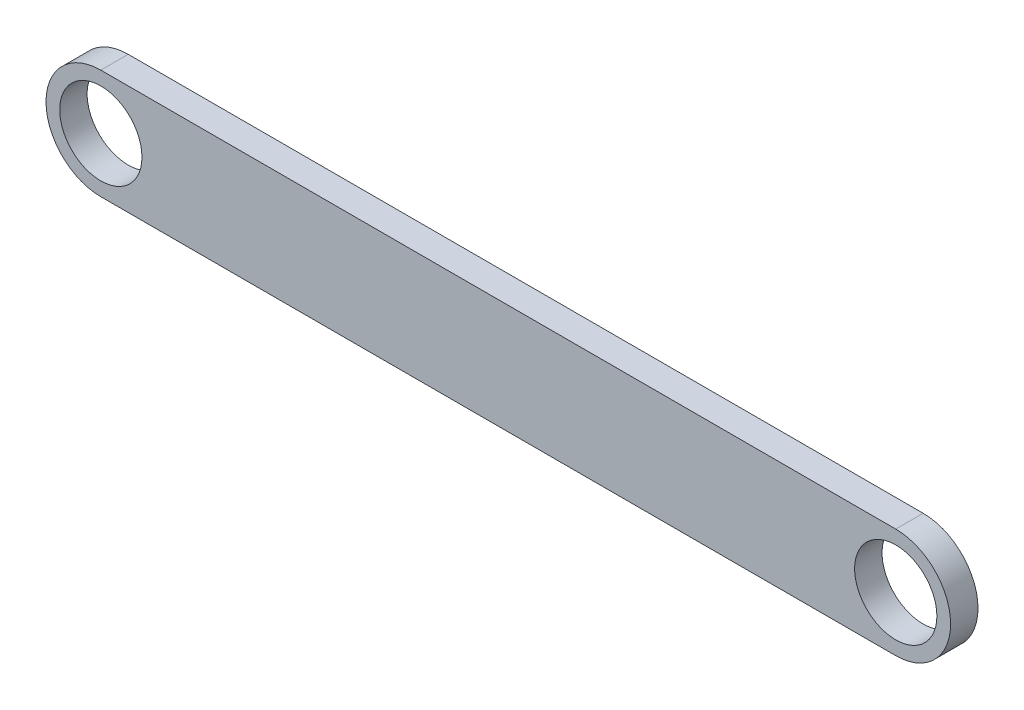
ISO-10303-21;
HEADER;
FILE_DESCRIPTION(('STEP AP214'),'2;1');
FILE_NAME('part.step','',(''),(''),'','','');
FILE_SCHEMA(('AUTOMOTIVE_DESIGN { 1 0 10303 214 1 1 1 1 }'));
ENDSEC;
DATA;
#1=APPLICATION_CONTEXT('core data for automotive mechanical design processes');
#2=APPLICATION_PROTOCOL_DEFINITION('international standard','automotive_design',2000,#1);
#3=PRODUCT_CONTEXT('',#1,'mechanical');
#4=PRODUCT('Part','Part','',(#3));
#5=PRODUCT_RELATED_PRODUCT_CATEGORY('part','',(#4));
#6=PRODUCT_DEFINITION_FORMATION('','',#4);
#7=PRODUCT_DEFINITION_CONTEXT('part definition',#1,'design');
#8=PRODUCT_DEFINITION('design','',#6,#7);
#9=PRODUCT_DEFINITION_SHAPE('','',#8);
#10=(LENGTH_UNIT() NAMED_UNIT(*) SI_UNIT(.MILLI.,.METRE.));
#11=(NAMED_UNIT(*) PLANE_ANGLE_UNIT() SI_UNIT($,.RADIAN.));
#12=(NAMED_UNIT(*) SI_UNIT($,.STERADIAN.) SOLID_ANGLE_UNIT());
#13=UNCERTAINTY_MEASURE_WITH_UNIT(LENGTH_MEASURE(1.E-05),#10,'distance_accuracy_value','');
#14=(GEOMETRIC_REPRESENTATION_CONTEXT(3) GLOBAL_UNCERTAINTY_ASSIGNED_CONTEXT((#13)) GLOBAL_UNIT_ASSIGNED_CONTEXT((#10,
#11,#12)) REPRESENTATION_CONTEXT('',''));
#15=CARTESIAN_POINT('',(0.,0.,0.));
#16=DIRECTION('',(0.,0.,1.));
#17=DIRECTION('',(1.,0.,0.));
#18=AXIS2_PLACEMENT_3D('',#15,#16,#17);
#19=CARTESIAN_POINT('',(0.,0.,10.));
#20=DIRECTION('',(0.,0.,1.));
#21=DIRECTION('',(1.,0.,0.));
#22=AXIS2_PLACEMENT_3D('',#19,#20,#21);
#23=PLANE('',#22);
#24=CARTESIAN_POINT('',(0.,0.,10.));
#25=DIRECTION('',(0.,0.,1.));
#26=DIRECTION('',(1.,0.,0.));
#27=AXIS2_PLACEMENT_3D('',#24,#25,#26);
#28=CIRCLE('',#27,15.);
#29=CARTESIAN_POINT('',(15.,0.,10.));
#30=VERTEX_POINT('',#29);
#31=EDGE_CURVE('E116',#30,#30,#28,.T.);
#32=ORIENTED_EDGE('',*,*,#31,.F.);
#33=EDGE_LOOP('',(#32));
#34=FACE_BOUND('',#33,.T.);
#35=CARTESIAN_POINT('',(0.,0.,10.));
#36=DIRECTION('',(0.,0.,1.));
#37=DIRECTION('',(1.,0.,0.));
#38=AXIS2_PLACEMENT_3D('',#35,#36,#37);
#39=CIRCLE('',#38,20.);
#40=CARTESIAN_POINT('',(0.,20.,10.));
#41=VERTEX_POINT('',#40);
#42=CARTESIAN_POINT('',(0.,-20.,10.));
#43=VERTEX_POINT('',#42);
#44=EDGE_CURVE('E96',#41,#43,#39,.T.);
#45=ORIENTED_EDGE('',*,*,#44,.T.);
#46=DIRECTION('',(1.,0.,0.));
#47=VECTOR('',#46,1.);
#48=CARTESIAN_POINT('',(0.,-20.,10.));
#49=LINE('',#48,#47);
#50=CARTESIAN_POINT('',(290.,-20.,10.));
#51=VERTEX_POINT('',#50);
#52=EDGE_CURVE('E91',#43,#51,#49,.T.);
#53=ORIENTED_EDGE('',*,*,#52,.T.);
#54=CARTESIAN_POINT('',(290.,0.,10.));
#55=DIRECTION('',(0.,0.,1.));
#56=DIRECTION('',(1.,0.,0.));
#57=AXIS2_PLACEMENT_3D('',#54,#55,#56);
#58=CIRCLE('',#57,20.);
#59=CARTESIAN_POINT('',(290.,20.,10.));
#60=VERTEX_POINT('',#59);
#61=EDGE_CURVE('E94',#51,#60,#58,.T.);
#62=ORIENTED_EDGE('',*,*,#61,.T.);
#63=DIRECTION('',(-1.,0.,0.));
#64=VECTOR('',#63,1.);
#65=CARTESIAN_POINT('',(0.,20.,10.));
#66=LINE('',#65,#64);
#67=EDGE_CURVE('E61',#60,#41,#66,.T.);
#68=ORIENTED_EDGE('',*,*,#67,.T.);
#69=EDGE_LOOP('',(#45,#53,#62,#68));
#70=FACE_BOUND('',#69,.T.);
#71=CARTESIAN_POINT('',(290.,0.,10.));
#72=DIRECTION('',(0.,0.,1.));
#73=DIRECTION('',(1.,0.,0.));
#74=AXIS2_PLACEMENT_3D('',#71,#72,#73);
#75=CIRCLE('',#74,15.);
#76=CARTESIAN_POINT('',(305.,0.,10.));
#77=VERTEX_POINT('',#76);
#78=EDGE_CURVE('E138',#77,#77,#75,.T.);
#79=ORIENTED_EDGE('',*,*,#78,.F.);
#80=EDGE_LOOP('',(#79));
#81=FACE_BOUND('',#80,.T.);
#82=ADVANCED_FACE('F43',(#34,#70,#81),#23,.T.);
#83=CARTESIAN_POINT('',(0.,0.,0.));
#84=DIRECTION('',(0.,0.,1.));
#85=DIRECTION('',(1.,0.,0.));
#86=AXIS2_PLACEMENT_3D('',#83,#84,#85);
#87=PLANE('',#86);
#88=CARTESIAN_POINT('',(0.,0.,0.));
#89=DIRECTION('',(0.,0.,1.));
#90=DIRECTION('',(1.,0.,0.));
#91=AXIS2_PLACEMENT_3D('',#88,#89,#90);
#92=CIRCLE('',#91,20.);
#93=CARTESIAN_POINT('',(0.,20.,0.));
#94=VERTEX_POINT('',#93);
#95=CARTESIAN_POINT('',(0.,-20.,0.));
#96=VERTEX_POINT('',#95);
#97=EDGE_CURVE('E112',#94,#96,#92,.T.);
#98=ORIENTED_EDGE('',*,*,#97,.F.);
#99=DIRECTION('',(-1.,0.,0.));
#100=VECTOR('',#99,1.);
#101=CARTESIAN_POINT('',(0.,20.,0.));
#102=LINE('',#101,#100);
#103=CARTESIAN_POINT('',(290.,20.,0.));
#104=VERTEX_POINT('',#103);
#105=EDGE_CURVE('E84',#104,#94,#102,.T.);
#106=ORIENTED_EDGE('',*,*,#105,.F.);
#107=CARTESIAN_POINT('',(290.,0.,0.));
#108=DIRECTION('',(0.,0.,1.));
#109=DIRECTION('',(1.,0.,0.));
#110=AXIS2_PLACEMENT_3D('',#107,#108,#109);
#111=CIRCLE('',#110,20.);
#112=CARTESIAN_POINT('',(290.,-20.,0.));
#113=VERTEX_POINT('',#112);
#114=EDGE_CURVE('E78',#113,#104,#111,.T.);
#115=ORIENTED_EDGE('',*,*,#114,.F.);
#116=DIRECTION('',(1.,0.,0.));
#117=VECTOR('',#116,1.);
#118=CARTESIAN_POINT('',(0.,-20.,0.));
#119=LINE('',#118,#117);
#120=EDGE_CURVE('E101',#96,#113,#119,.T.);
#121=ORIENTED_EDGE('',*,*,#120,.F.);
#122=EDGE_LOOP('',(#98,#106,#115,#121));
#123=FACE_BOUND('',#122,.T.);
#124=CARTESIAN_POINT('',(0.,0.,0.));
#125=DIRECTION('',(0.,0.,1.));
#126=DIRECTION('',(1.,0.,0.));
#127=AXIS2_PLACEMENT_3D('',#124,#125,#126);
#128=CIRCLE('',#127,15.);
#129=CARTESIAN_POINT('',(15.,0.,0.));
#130=VERTEX_POINT('',#129);
#131=EDGE_CURVE('E134',#130,#130,#128,.T.);
#132=ORIENTED_EDGE('',*,*,#131,.T.);
#133=EDGE_LOOP('',(#132));
#134=FACE_BOUND('',#133,.T.);
#135=CARTESIAN_POINT('',(290.,0.,0.));
#136=DIRECTION('',(0.,0.,1.));
#137=DIRECTION('',(1.,0.,0.));
#138=AXIS2_PLACEMENT_3D('',#135,#136,#137);
#139=CIRCLE('',#138,15.);
#140=CARTESIAN_POINT('',(305.,0.,0.));
#141=VERTEX_POINT('',#140);
#142=EDGE_CURVE('E142',#141,#141,#139,.T.);
#143=ORIENTED_EDGE('',*,*,#142,.T.);
#144=EDGE_LOOP('',(#143));
#145=FACE_BOUND('',#144,.T.);
#146=ADVANCED_FACE('F129',(#123,#134,#145),#87,.F.);
#147=CARTESIAN_POINT('',(0.,0.,10.));
#148=DIRECTION('',(0.,0.,-1.));
#149=DIRECTION('',(-1.,0.,0.));
#150=AXIS2_PLACEMENT_3D('',#147,#148,#149);
#151=CYLINDRICAL_SURFACE('',#150,20.);
#152=ORIENTED_EDGE('',*,*,#97,.T.);
#153=DIRECTION('',(0.,0.,-1.));
#154=VECTOR('',#153,1.);
#155=CARTESIAN_POINT('',(0.,-20.,10.));
#156=LINE('',#155,#154);
#157=EDGE_CURVE('E11',#43,#96,#156,.T.);
#158=ORIENTED_EDGE('',*,*,#157,.F.);
#159=ORIENTED_EDGE('',*,*,#44,.F.);
#160=DIRECTION('',(0.,0.,-1.));
#161=VECTOR('',#160,1.);
#162=CARTESIAN_POINT('',(0.,20.,10.));
#163=LINE('',#162,#161);
#164=EDGE_CURVE('E108',#41,#94,#163,.T.);
#165=ORIENTED_EDGE('',*,*,#164,.T.);
#166=EDGE_LOOP('',(#152,#158,#159,#165));
#167=FACE_BOUND('',#166,.T.);
#168=ADVANCED_FACE('F45',(#167),#151,.T.);
#169=CARTESIAN_POINT('',(0.,-20.,10.));
#170=DIRECTION('',(0.,1.,0.));
#171=DIRECTION('',(-1.,0.,0.));
#172=AXIS2_PLACEMENT_3D('',#169,#170,#171);
#173=PLANE('',#172);
#174=ORIENTED_EDGE('',*,*,#120,.T.);
#175=DIRECTION('',(0.,0.,-1.));
#176=VECTOR('',#175,1.);
#177=CARTESIAN_POINT('',(290.,-20.,10.));
#178=LINE('',#177,#176);
#179=EDGE_CURVE('E53',#51,#113,#178,.T.);
#180=ORIENTED_EDGE('',*,*,#179,.F.);
#181=ORIENTED_EDGE('',*,*,#52,.F.);
#182=ORIENTED_EDGE('',*,*,#157,.T.);
#183=EDGE_LOOP('',(#174,#180,#181,#182));
#184=FACE_BOUND('',#183,.T.);
#185=ADVANCED_FACE('F100',(#184),#173,.F.);
#186=CARTESIAN_POINT('',(290.,0.,10.));
#187=DIRECTION('',(0.,0.,-1.));
#188=DIRECTION('',(-1.,0.,0.));
#189=AXIS2_PLACEMENT_3D('',#186,#187,#188);
#190=CYLINDRICAL_SURFACE('',#189,20.);
#191=ORIENTED_EDGE('',*,*,#114,.T.);
#192=DIRECTION('',(0.,0.,-1.));
#193=VECTOR('',#192,1.);
#194=CARTESIAN_POINT('',(290.,20.,10.));
#195=LINE('',#194,#193);
#196=EDGE_CURVE('E103',#60,#104,#195,.T.);
#197=ORIENTED_EDGE('',*,*,#196,.F.);
#198=ORIENTED_EDGE('',*,*,#61,.F.);
#199=ORIENTED_EDGE('',*,*,#179,.T.);
#200=EDGE_LOOP('',(#191,#197,#198,#199));
#201=FACE_BOUND('',#200,.T.);
#202=ADVANCED_FACE('F104',(#201),#190,.T.);
#203=CARTESIAN_POINT('',(0.,20.,10.));
#204=DIRECTION('',(0.,-1.,0.));
#205=DIRECTION('',(1.,0.,0.));
#206=AXIS2_PLACEMENT_3D('',#203,#204,#205);
#207=PLANE('',#206);
#208=ORIENTED_EDGE('',*,*,#105,.T.);
#209=ORIENTED_EDGE('',*,*,#164,.F.);
#210=ORIENTED_EDGE('',*,*,#67,.F.);
#211=ORIENTED_EDGE('',*,*,#196,.T.);
#212=EDGE_LOOP('',(#208,#209,#210,#211));
#213=FACE_BOUND('',#212,.T.);
#214=ADVANCED_FACE('F126',(#213),#207,.F.);
#215=CARTESIAN_POINT('',(0.,0.,10.));
#216=DIRECTION('',(0.,0.,-1.));
#217=DIRECTION('',(-1.,0.,0.));
#218=AXIS2_PLACEMENT_3D('',#215,#216,#217);
#219=CYLINDRICAL_SURFACE('',#218,15.);
#220=ORIENTED_EDGE('',*,*,#31,.T.);
#221=EDGE_LOOP('',(#220));
#222=FACE_BOUND('',#221,.T.);
#223=ORIENTED_EDGE('',*,*,#131,.F.);
#224=EDGE_LOOP('',(#223));
#225=FACE_BOUND('',#224,.T.);
#226=ADVANCED_FACE('F161',(#222,#225),#219,.F.);
#227=CARTESIAN_POINT('',(290.,0.,10.));
#228=DIRECTION('',(0.,0.,-1.));
#229=DIRECTION('',(-1.,0.,0.));
#230=AXIS2_PLACEMENT_3D('',#227,#228,#229);
#231=CYLINDRICAL_SURFACE('',#230,15.);
#232=ORIENTED_EDGE('',*,*,#78,.T.);
#233=EDGE_LOOP('',(#232));
#234=FACE_BOUND('',#233,.T.);
#235=ORIENTED_EDGE('',*,*,#142,.F.);
#236=EDGE_LOOP('',(#235));
#237=FACE_BOUND('',#236,.T.);
#238=ADVANCED_FACE('F150',(#234,#237),#231,.F.);
#239=CLOSED_SHELL('',(#82,#146,#168,#185,#202,#214,#226,#238));
#240=MANIFOLD_SOLID_BREP('B2',#239);
#241=ADVANCED_BREP_SHAPE_REPRESENTATION('',(#18,#240),#14);
#242=SHAPE_DEFINITION_REPRESENTATION(#9,#241);
ENDSEC;
END-ISO-10303-21;
